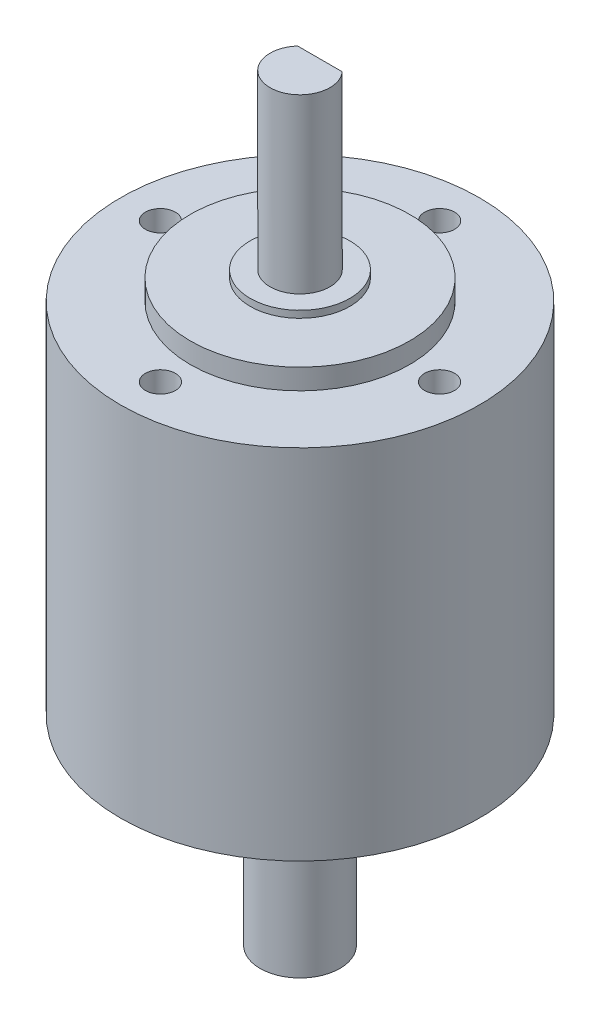
ISO-10303-21;
HEADER;
FILE_DESCRIPTION(('STEP AP214'),'2;1');
FILE_NAME('part.step','',(''),(''),'','','');
FILE_SCHEMA(('AUTOMOTIVE_DESIGN { 1 0 10303 214 1 1 1 1 }'));
ENDSEC;
DATA;
#1=APPLICATION_CONTEXT('core data for automotive mechanical design processes');
#2=APPLICATION_PROTOCOL_DEFINITION('international standard','automotive_design',2000,#1);
#3=PRODUCT_CONTEXT('',#1,'mechanical');
#4=PRODUCT('Part','Part','',(#3));
#5=PRODUCT_RELATED_PRODUCT_CATEGORY('part','',(#4));
#6=PRODUCT_DEFINITION_FORMATION('','',#4);
#7=PRODUCT_DEFINITION_CONTEXT('part definition',#1,'design');
#8=PRODUCT_DEFINITION('design','',#6,#7);
#9=PRODUCT_DEFINITION_SHAPE('','',#8);
#10=(LENGTH_UNIT() NAMED_UNIT(*) SI_UNIT(.MILLI.,.METRE.));
#11=(NAMED_UNIT(*) PLANE_ANGLE_UNIT() SI_UNIT($,.RADIAN.));
#12=(NAMED_UNIT(*) SI_UNIT($,.STERADIAN.) SOLID_ANGLE_UNIT());
#13=UNCERTAINTY_MEASURE_WITH_UNIT(LENGTH_MEASURE(1.E-05),#10,'distance_accuracy_value','');
#14=(GEOMETRIC_REPRESENTATION_CONTEXT(3) GLOBAL_UNCERTAINTY_ASSIGNED_CONTEXT((#13)) GLOBAL_UNIT_ASSIGNED_CONTEXT((#10,
#11,#12)) REPRESENTATION_CONTEXT('',''));
#15=CARTESIAN_POINT('',(0.,0.,0.));
#16=DIRECTION('',(0.,0.,1.));
#17=DIRECTION('',(1.,0.,0.));
#18=AXIS2_PLACEMENT_3D('',#15,#16,#17);
#19=CARTESIAN_POINT('',(0.,17.9451,0.));
#20=DIRECTION('',(0.,-1.,0.));
#21=DIRECTION('',(0.,0.,-1.));
#22=AXIS2_PLACEMENT_3D('',#19,#20,#21);
#23=CYLINDRICAL_SURFACE('',#22,18.);
#24=CARTESIAN_POINT('',(0.,17.9451,0.));
#25=DIRECTION('',(0.,1.,0.));
#26=DIRECTION('',(0.,0.,1.));
#27=AXIS2_PLACEMENT_3D('',#24,#25,#26);
#28=CIRCLE('',#27,18.);
#29=CARTESIAN_POINT('',(0.,17.9451,18.));
#30=VERTEX_POINT('',#29);
#31=EDGE_CURVE('E209',#30,#30,#28,.T.);
#32=ORIENTED_EDGE('',*,*,#31,.F.);
#33=EDGE_LOOP('',(#32));
#34=FACE_BOUND('',#33,.T.);
#35=CARTESIAN_POINT('',(0.,-17.9451,0.));
#36=DIRECTION('',(0.,1.,0.));
#37=DIRECTION('',(0.,0.,1.));
#38=AXIS2_PLACEMENT_3D('',#35,#36,#37);
#39=CIRCLE('',#38,18.);
#40=CARTESIAN_POINT('',(0.,-17.9451,18.));
#41=VERTEX_POINT('',#40);
#42=EDGE_CURVE('E208',#41,#41,#39,.T.);
#43=ORIENTED_EDGE('',*,*,#42,.T.);
#44=EDGE_LOOP('',(#43));
#45=FACE_BOUND('',#44,.T.);
#46=ADVANCED_FACE('F42',(#34,#45),#23,.T.);
#47=CARTESIAN_POINT('',(0.,17.9451,0.));
#48=DIRECTION('',(0.,1.,0.));
#49=DIRECTION('',(0.,0.,1.));
#50=AXIS2_PLACEMENT_3D('',#47,#48,#49);
#51=PLANE('',#50);
#52=CARTESIAN_POINT('',(0.,17.9451,-14.));
#53=DIRECTION('',(0.,1.,0.));
#54=DIRECTION('',(0.,0.,1.));
#55=AXIS2_PLACEMENT_3D('',#52,#53,#54);
#56=CIRCLE('',#55,1.5);
#57=CARTESIAN_POINT('',(0.,17.9451,-12.5));
#58=VERTEX_POINT('',#57);
#59=EDGE_CURVE('E150',#58,#58,#56,.T.);
#60=ORIENTED_EDGE('',*,*,#59,.F.);
#61=EDGE_LOOP('',(#60));
#62=FACE_BOUND('',#61,.T.);
#63=CARTESIAN_POINT('',(-14.,17.9451,0.));
#64=DIRECTION('',(0.,1.,0.));
#65=DIRECTION('',(0.,0.,1.));
#66=AXIS2_PLACEMENT_3D('',#63,#64,#65);
#67=CIRCLE('',#66,1.5);
#68=CARTESIAN_POINT('',(-14.,17.9451,1.5));
#69=VERTEX_POINT('',#68);
#70=EDGE_CURVE('E158',#69,#69,#67,.T.);
#71=ORIENTED_EDGE('',*,*,#70,.F.);
#72=EDGE_LOOP('',(#71));
#73=FACE_BOUND('',#72,.T.);
#74=CARTESIAN_POINT('',(0.,17.9451,14.));
#75=DIRECTION('',(0.,1.,0.));
#76=DIRECTION('',(0.,0.,1.));
#77=AXIS2_PLACEMENT_3D('',#74,#75,#76);
#78=CIRCLE('',#77,1.5);
#79=CARTESIAN_POINT('',(0.,17.9451,15.5));
#80=VERTEX_POINT('',#79);
#81=EDGE_CURVE('E166',#80,#80,#78,.T.);
#82=ORIENTED_EDGE('',*,*,#81,.F.);
#83=EDGE_LOOP('',(#82));
#84=FACE_BOUND('',#83,.T.);
#85=CARTESIAN_POINT('',(14.,17.9451,0.));
#86=DIRECTION('',(0.,1.,0.));
#87=DIRECTION('',(0.,0.,1.));
#88=AXIS2_PLACEMENT_3D('',#85,#86,#87);
#89=CIRCLE('',#88,1.5);
#90=CARTESIAN_POINT('',(14.,17.9451,1.5));
#91=VERTEX_POINT('',#90);
#92=EDGE_CURVE('E117',#91,#91,#89,.T.);
#93=ORIENTED_EDGE('',*,*,#92,.F.);
#94=EDGE_LOOP('',(#93));
#95=FACE_BOUND('',#94,.T.);
#96=CARTESIAN_POINT('',(0.,17.9451,0.));
#97=DIRECTION('',(0.,1.,0.));
#98=DIRECTION('',(0.,0.,1.));
#99=AXIS2_PLACEMENT_3D('',#96,#97,#98);
#100=CIRCLE('',#99,11.);
#101=CARTESIAN_POINT('',(0.,17.9451,11.));
#102=VERTEX_POINT('',#101);
#103=EDGE_CURVE('E201',#102,#102,#100,.F.);
#104=ORIENTED_EDGE('',*,*,#103,.T.);
#105=EDGE_LOOP('',(#104));
#106=FACE_BOUND('',#105,.T.);
#107=ORIENTED_EDGE('',*,*,#31,.T.);
#108=EDGE_LOOP('',(#107));
#109=FACE_BOUND('',#108,.T.);
#110=ADVANCED_FACE('F262',(#62,#73,#84,#95,#106,#109),#51,.T.);
#111=CARTESIAN_POINT('',(0.,-17.9451,0.));
#112=DIRECTION('',(0.,1.,0.));
#113=DIRECTION('',(0.,0.,1.));
#114=AXIS2_PLACEMENT_3D('',#111,#112,#113);
#115=PLANE('',#114);
#116=CARTESIAN_POINT('',(0.,-17.9451,-14.));
#117=DIRECTION('',(0.,1.,0.));
#118=DIRECTION('',(0.,0.,1.));
#119=AXIS2_PLACEMENT_3D('',#116,#117,#118);
#120=CIRCLE('',#119,1.5);
#121=CARTESIAN_POINT('',(0.,-17.9451,-12.5));
#122=VERTEX_POINT('',#121);
#123=EDGE_CURVE('E118',#122,#122,#120,.T.);
#124=ORIENTED_EDGE('',*,*,#123,.T.);
#125=EDGE_LOOP('',(#124));
#126=FACE_BOUND('',#125,.T.);
#127=CARTESIAN_POINT('',(-14.,-17.9451,0.));
#128=DIRECTION('',(0.,1.,0.));
#129=DIRECTION('',(0.,0.,1.));
#130=AXIS2_PLACEMENT_3D('',#127,#128,#129);
#131=CIRCLE('',#130,1.5);
#132=CARTESIAN_POINT('',(-14.,-17.9451,1.5));
#133=VERTEX_POINT('',#132);
#134=EDGE_CURVE('E126',#133,#133,#131,.T.);
#135=ORIENTED_EDGE('',*,*,#134,.T.);
#136=EDGE_LOOP('',(#135));
#137=FACE_BOUND('',#136,.T.);
#138=CARTESIAN_POINT('',(0.,-17.9451,14.));
#139=DIRECTION('',(0.,1.,0.));
#140=DIRECTION('',(0.,0.,1.));
#141=AXIS2_PLACEMENT_3D('',#138,#139,#140);
#142=CIRCLE('',#141,1.5);
#143=CARTESIAN_POINT('',(0.,-17.9451,15.5));
#144=VERTEX_POINT('',#143);
#145=EDGE_CURVE('E134',#144,#144,#142,.T.);
#146=ORIENTED_EDGE('',*,*,#145,.T.);
#147=EDGE_LOOP('',(#146));
#148=FACE_BOUND('',#147,.T.);
#149=CARTESIAN_POINT('',(14.,-17.9451,0.));
#150=DIRECTION('',(0.,1.,0.));
#151=DIRECTION('',(0.,0.,1.));
#152=AXIS2_PLACEMENT_3D('',#149,#150,#151);
#153=CIRCLE('',#152,1.5);
#154=CARTESIAN_POINT('',(14.,-17.9451,1.5));
#155=VERTEX_POINT('',#154);
#156=EDGE_CURVE('E112',#155,#155,#153,.T.);
#157=ORIENTED_EDGE('',*,*,#156,.T.);
#158=EDGE_LOOP('',(#157));
#159=FACE_BOUND('',#158,.T.);
#160=CARTESIAN_POINT('',(0.,-17.9451,0.));
#161=DIRECTION('',(0.,1.,0.));
#162=DIRECTION('',(0.,0.,1.));
#163=AXIS2_PLACEMENT_3D('',#160,#161,#162);
#164=CIRCLE('',#163,11.);
#165=CARTESIAN_POINT('',(0.,-17.9451,11.));
#166=VERTEX_POINT('',#165);
#167=EDGE_CURVE('E213',#166,#166,#164,.F.);
#168=ORIENTED_EDGE('',*,*,#167,.F.);
#169=EDGE_LOOP('',(#168));
#170=FACE_BOUND('',#169,.T.);
#171=ORIENTED_EDGE('',*,*,#42,.F.);
#172=EDGE_LOOP('',(#171));
#173=FACE_BOUND('',#172,.T.);
#174=ADVANCED_FACE('F267',(#126,#137,#148,#159,#170,#173),#115,.F.);
#175=CARTESIAN_POINT('',(0.,-20.0025,0.));
#176=DIRECTION('',(0.,1.,0.));
#177=DIRECTION('',(0.,0.,1.));
#178=AXIS2_PLACEMENT_3D('',#175,#176,#177);
#179=PLANE('',#178);
#180=CARTESIAN_POINT('',(0.,-20.0025,0.));
#181=DIRECTION('',(0.,1.,0.));
#182=DIRECTION('',(0.,0.,1.));
#183=AXIS2_PLACEMENT_3D('',#180,#181,#182);
#184=CIRCLE('',#183,5.);
#185=CARTESIAN_POINT('',(0.,-20.0025,5.));
#186=VERTEX_POINT('',#185);
#187=EDGE_CURVE('E13',#186,#186,#184,.F.);
#188=ORIENTED_EDGE('',*,*,#187,.F.);
#189=EDGE_LOOP('',(#188));
#190=FACE_BOUND('',#189,.T.);
#191=CARTESIAN_POINT('',(0.,-20.0025,0.));
#192=DIRECTION('',(0.,1.,0.));
#193=DIRECTION('',(0.,0.,1.));
#194=AXIS2_PLACEMENT_3D('',#191,#192,#193);
#195=CIRCLE('',#194,11.);
#196=CARTESIAN_POINT('',(0.,-20.0025,11.));
#197=VERTEX_POINT('',#196);
#198=EDGE_CURVE('E196',#197,#197,#195,.T.);
#199=ORIENTED_EDGE('',*,*,#198,.F.);
#200=EDGE_LOOP('',(#199));
#201=FACE_BOUND('',#200,.T.);
#202=ADVANCED_FACE('F275',(#190,#201),#179,.F.);
#203=CARTESIAN_POINT('',(0.,20.0025,0.));
#204=DIRECTION('',(0.,-1.,0.));
#205=DIRECTION('',(0.,0.,-1.));
#206=AXIS2_PLACEMENT_3D('',#203,#204,#205);
#207=CYLINDRICAL_SURFACE('',#206,11.);
#208=ORIENTED_EDGE('',*,*,#198,.T.);
#209=EDGE_LOOP('',(#208));
#210=FACE_BOUND('',#209,.T.);
#211=ORIENTED_EDGE('',*,*,#167,.T.);
#212=EDGE_LOOP('',(#211));
#213=FACE_BOUND('',#212,.T.);
#214=ADVANCED_FACE('F281',(#210,#213),#207,.T.);
#215=ORIENTED_EDGE('',*,*,#103,.F.);
#216=EDGE_LOOP('',(#215));
#217=FACE_BOUND('',#216,.T.);
#218=CARTESIAN_POINT('',(0.,20.0025,0.));
#219=DIRECTION('',(0.,1.,0.));
#220=DIRECTION('',(0.,0.,1.));
#221=AXIS2_PLACEMENT_3D('',#218,#219,#220);
#222=CIRCLE('',#221,11.);
#223=CARTESIAN_POINT('',(0.,20.0025,11.));
#224=VERTEX_POINT('',#223);
#225=EDGE_CURVE('E197',#224,#224,#222,.T.);
#226=ORIENTED_EDGE('',*,*,#225,.F.);
#227=EDGE_LOOP('',(#226));
#228=FACE_BOUND('',#227,.T.);
#229=ADVANCED_FACE('F286',(#217,#228),#207,.T.);
#230=CARTESIAN_POINT('',(0.,20.0025,0.));
#231=DIRECTION('',(0.,1.,0.));
#232=DIRECTION('',(0.,0.,1.));
#233=AXIS2_PLACEMENT_3D('',#230,#231,#232);
#234=PLANE('',#233);
#235=CARTESIAN_POINT('',(0.,20.0025,0.));
#236=DIRECTION('',(0.,1.,0.));
#237=DIRECTION('',(0.,0.,1.));
#238=AXIS2_PLACEMENT_3D('',#235,#236,#237);
#239=CIRCLE('',#238,5.);
#240=CARTESIAN_POINT('',(0.,20.0025,5.));
#241=VERTEX_POINT('',#240);
#242=EDGE_CURVE('E45',#241,#241,#239,.F.);
#243=ORIENTED_EDGE('',*,*,#242,.T.);
#244=EDGE_LOOP('',(#243));
#245=FACE_BOUND('',#244,.T.);
#246=ORIENTED_EDGE('',*,*,#225,.T.);
#247=EDGE_LOOP('',(#246));
#248=FACE_BOUND('',#247,.T.);
#249=ADVANCED_FACE('F288',(#245,#248),#234,.T.);
#250=CARTESIAN_POINT('',(14.,13.9451,0.));
#251=DIRECTION('',(0.,1.,0.));
#252=DIRECTION('',(0.,0.,1.));
#253=AXIS2_PLACEMENT_3D('',#250,#251,#252);
#254=CYLINDRICAL_SURFACE('',#253,1.5);
#255=CARTESIAN_POINT('',(14.,13.9451,0.));
#256=DIRECTION('',(0.,1.,0.));
#257=DIRECTION('',(0.,0.,1.));
#258=AXIS2_PLACEMENT_3D('',#255,#256,#257);
#259=CIRCLE('',#258,1.5);
#260=CARTESIAN_POINT('',(14.,13.9451,1.5));
#261=VERTEX_POINT('',#260);
#262=EDGE_CURVE('E170',#261,#261,#259,.T.);
#263=ORIENTED_EDGE('',*,*,#262,.F.);
#264=EDGE_LOOP('',(#263));
#265=FACE_BOUND('',#264,.T.);
#266=ORIENTED_EDGE('',*,*,#92,.T.);
#267=EDGE_LOOP('',(#266));
#268=FACE_BOUND('',#267,.T.);
#269=ADVANCED_FACE('F293',(#265,#268),#254,.F.);
#270=CARTESIAN_POINT('',(14.,13.9451,0.));
#271=DIRECTION('',(0.,1.,0.));
#272=DIRECTION('',(0.,0.,1.));
#273=AXIS2_PLACEMENT_3D('',#270,#271,#272);
#274=PLANE('',#273);
#275=ORIENTED_EDGE('',*,*,#262,.T.);
#276=EDGE_LOOP('',(#275));
#277=FACE_BOUND('',#276,.T.);
#278=ADVANCED_FACE('F312',(#277),#274,.T.);
#279=CARTESIAN_POINT('',(0.,13.9451,14.));
#280=DIRECTION('',(0.,1.,0.));
#281=DIRECTION('',(0.,0.,1.));
#282=AXIS2_PLACEMENT_3D('',#279,#280,#281);
#283=CYLINDRICAL_SURFACE('',#282,1.5);
#284=CARTESIAN_POINT('',(0.,13.9451,14.));
#285=DIRECTION('',(0.,1.,0.));
#286=DIRECTION('',(0.,0.,1.));
#287=AXIS2_PLACEMENT_3D('',#284,#285,#286);
#288=CIRCLE('',#287,1.5);
#289=CARTESIAN_POINT('',(0.,13.9451,15.5));
#290=VERTEX_POINT('',#289);
#291=EDGE_CURVE('E162',#290,#290,#288,.T.);
#292=ORIENTED_EDGE('',*,*,#291,.F.);
#293=EDGE_LOOP('',(#292));
#294=FACE_BOUND('',#293,.T.);
#295=ORIENTED_EDGE('',*,*,#81,.T.);
#296=EDGE_LOOP('',(#295));
#297=FACE_BOUND('',#296,.T.);
#298=ADVANCED_FACE('F316',(#294,#297),#283,.F.);
#299=CARTESIAN_POINT('',(0.,13.9451,14.));
#300=DIRECTION('',(0.,1.,0.));
#301=DIRECTION('',(0.,0.,1.));
#302=AXIS2_PLACEMENT_3D('',#299,#300,#301);
#303=PLANE('',#302);
#304=ORIENTED_EDGE('',*,*,#291,.T.);
#305=EDGE_LOOP('',(#304));
#306=FACE_BOUND('',#305,.T.);
#307=ADVANCED_FACE('F320',(#306),#303,.T.);
#308=CARTESIAN_POINT('',(-14.,13.9451,0.));
#309=DIRECTION('',(0.,1.,0.));
#310=DIRECTION('',(0.,0.,1.));
#311=AXIS2_PLACEMENT_3D('',#308,#309,#310);
#312=CYLINDRICAL_SURFACE('',#311,1.5);
#313=CARTESIAN_POINT('',(-14.,13.9451,0.));
#314=DIRECTION('',(0.,1.,0.));
#315=DIRECTION('',(0.,0.,1.));
#316=AXIS2_PLACEMENT_3D('',#313,#314,#315);
#317=CIRCLE('',#316,1.5);
#318=CARTESIAN_POINT('',(-14.,13.9451,1.5));
#319=VERTEX_POINT('',#318);
#320=EDGE_CURVE('E154',#319,#319,#317,.T.);
#321=ORIENTED_EDGE('',*,*,#320,.F.);
#322=EDGE_LOOP('',(#321));
#323=FACE_BOUND('',#322,.T.);
#324=ORIENTED_EDGE('',*,*,#70,.T.);
#325=EDGE_LOOP('',(#324));
#326=FACE_BOUND('',#325,.T.);
#327=ADVANCED_FACE('F324',(#323,#326),#312,.F.);
#328=CARTESIAN_POINT('',(-14.,13.9451,0.));
#329=DIRECTION('',(0.,1.,0.));
#330=DIRECTION('',(0.,0.,1.));
#331=AXIS2_PLACEMENT_3D('',#328,#329,#330);
#332=PLANE('',#331);
#333=ORIENTED_EDGE('',*,*,#320,.T.);
#334=EDGE_LOOP('',(#333));
#335=FACE_BOUND('',#334,.T.);
#336=ADVANCED_FACE('F328',(#335),#332,.T.);
#337=CARTESIAN_POINT('',(0.,13.9451,-14.));
#338=DIRECTION('',(0.,1.,0.));
#339=DIRECTION('',(0.,0.,1.));
#340=AXIS2_PLACEMENT_3D('',#337,#338,#339);
#341=CYLINDRICAL_SURFACE('',#340,1.5);
#342=CARTESIAN_POINT('',(0.,13.9451,-14.));
#343=DIRECTION('',(0.,1.,0.));
#344=DIRECTION('',(0.,0.,1.));
#345=AXIS2_PLACEMENT_3D('',#342,#343,#344);
#346=CIRCLE('',#345,1.5);
#347=CARTESIAN_POINT('',(0.,13.9451,-12.5));
#348=VERTEX_POINT('',#347);
#349=EDGE_CURVE('E145',#348,#348,#346,.T.);
#350=ORIENTED_EDGE('',*,*,#349,.F.);
#351=EDGE_LOOP('',(#350));
#352=FACE_BOUND('',#351,.T.);
#353=ORIENTED_EDGE('',*,*,#59,.T.);
#354=EDGE_LOOP('',(#353));
#355=FACE_BOUND('',#354,.T.);
#356=ADVANCED_FACE('F332',(#352,#355),#341,.F.);
#357=CARTESIAN_POINT('',(0.,13.9451,-14.));
#358=DIRECTION('',(0.,1.,0.));
#359=DIRECTION('',(0.,0.,1.));
#360=AXIS2_PLACEMENT_3D('',#357,#358,#359);
#361=PLANE('',#360);
#362=ORIENTED_EDGE('',*,*,#349,.T.);
#363=EDGE_LOOP('',(#362));
#364=FACE_BOUND('',#363,.T.);
#365=ADVANCED_FACE('F336',(#364),#361,.T.);
#366=CARTESIAN_POINT('',(14.,-13.9451,0.));
#367=DIRECTION('',(0.,-1.,0.));
#368=DIRECTION('',(0.,0.,-1.));
#369=AXIS2_PLACEMENT_3D('',#366,#367,#368);
#370=CYLINDRICAL_SURFACE('',#369,1.5);
#371=CARTESIAN_POINT('',(14.,-13.9451,0.));
#372=DIRECTION('',(0.,1.,0.));
#373=DIRECTION('',(0.,0.,1.));
#374=AXIS2_PLACEMENT_3D('',#371,#372,#373);
#375=CIRCLE('',#374,1.5);
#376=CARTESIAN_POINT('',(14.,-13.9451,1.5));
#377=VERTEX_POINT('',#376);
#378=EDGE_CURVE('E138',#377,#377,#375,.T.);
#379=ORIENTED_EDGE('',*,*,#378,.T.);
#380=EDGE_LOOP('',(#379));
#381=FACE_BOUND('',#380,.T.);
#382=ORIENTED_EDGE('',*,*,#156,.F.);
#383=EDGE_LOOP('',(#382));
#384=FACE_BOUND('',#383,.T.);
#385=ADVANCED_FACE('F340',(#381,#384),#370,.F.);
#386=CARTESIAN_POINT('',(14.,-13.9451,0.));
#387=DIRECTION('',(0.,-1.,0.));
#388=DIRECTION('',(0.,0.,1.));
#389=AXIS2_PLACEMENT_3D('',#386,#387,#388);
#390=PLANE('',#389);
#391=ORIENTED_EDGE('',*,*,#378,.F.);
#392=EDGE_LOOP('',(#391));
#393=FACE_BOUND('',#392,.T.);
#394=ADVANCED_FACE('F344',(#393),#390,.T.);
#395=CARTESIAN_POINT('',(0.,-13.9451,14.));
#396=DIRECTION('',(0.,-1.,0.));
#397=DIRECTION('',(0.,0.,-1.));
#398=AXIS2_PLACEMENT_3D('',#395,#396,#397);
#399=CYLINDRICAL_SURFACE('',#398,1.5);
#400=CARTESIAN_POINT('',(0.,-13.9451,14.));
#401=DIRECTION('',(0.,1.,0.));
#402=DIRECTION('',(0.,0.,1.));
#403=AXIS2_PLACEMENT_3D('',#400,#401,#402);
#404=CIRCLE('',#403,1.5);
#405=CARTESIAN_POINT('',(0.,-13.9451,15.5));
#406=VERTEX_POINT('',#405);
#407=EDGE_CURVE('E130',#406,#406,#404,.T.);
#408=ORIENTED_EDGE('',*,*,#407,.T.);
#409=EDGE_LOOP('',(#408));
#410=FACE_BOUND('',#409,.T.);
#411=ORIENTED_EDGE('',*,*,#145,.F.);
#412=EDGE_LOOP('',(#411));
#413=FACE_BOUND('',#412,.T.);
#414=ADVANCED_FACE('F348',(#410,#413),#399,.F.);
#415=CARTESIAN_POINT('',(0.,-13.9451,14.));
#416=DIRECTION('',(0.,-1.,0.));
#417=DIRECTION('',(0.,0.,1.));
#418=AXIS2_PLACEMENT_3D('',#415,#416,#417);
#419=PLANE('',#418);
#420=ORIENTED_EDGE('',*,*,#407,.F.);
#421=EDGE_LOOP('',(#420));
#422=FACE_BOUND('',#421,.T.);
#423=ADVANCED_FACE('F352',(#422),#419,.T.);
#424=CARTESIAN_POINT('',(-14.,-13.9451,0.));
#425=DIRECTION('',(0.,-1.,0.));
#426=DIRECTION('',(0.,0.,-1.));
#427=AXIS2_PLACEMENT_3D('',#424,#425,#426);
#428=CYLINDRICAL_SURFACE('',#427,1.5);
#429=CARTESIAN_POINT('',(-14.,-13.9451,0.));
#430=DIRECTION('',(0.,1.,0.));
#431=DIRECTION('',(0.,0.,1.));
#432=AXIS2_PLACEMENT_3D('',#429,#430,#431);
#433=CIRCLE('',#432,1.5);
#434=CARTESIAN_POINT('',(-14.,-13.9451,1.5));
#435=VERTEX_POINT('',#434);
#436=EDGE_CURVE('E122',#435,#435,#433,.T.);
#437=ORIENTED_EDGE('',*,*,#436,.T.);
#438=EDGE_LOOP('',(#437));
#439=FACE_BOUND('',#438,.T.);
#440=ORIENTED_EDGE('',*,*,#134,.F.);
#441=EDGE_LOOP('',(#440));
#442=FACE_BOUND('',#441,.T.);
#443=ADVANCED_FACE('F356',(#439,#442),#428,.F.);
#444=CARTESIAN_POINT('',(-14.,-13.9451,0.));
#445=DIRECTION('',(0.,-1.,0.));
#446=DIRECTION('',(0.,0.,1.));
#447=AXIS2_PLACEMENT_3D('',#444,#445,#446);
#448=PLANE('',#447);
#449=ORIENTED_EDGE('',*,*,#436,.F.);
#450=EDGE_LOOP('',(#449));
#451=FACE_BOUND('',#450,.T.);
#452=ADVANCED_FACE('F360',(#451),#448,.T.);
#453=CARTESIAN_POINT('',(0.,-13.9451,-14.));
#454=DIRECTION('',(0.,-1.,0.));
#455=DIRECTION('',(0.,0.,-1.));
#456=AXIS2_PLACEMENT_3D('',#453,#454,#455);
#457=CYLINDRICAL_SURFACE('',#456,1.5);
#458=CARTESIAN_POINT('',(0.,-13.9451,-14.));
#459=DIRECTION('',(0.,1.,0.));
#460=DIRECTION('',(0.,0.,1.));
#461=AXIS2_PLACEMENT_3D('',#458,#459,#460);
#462=CIRCLE('',#461,1.5);
#463=CARTESIAN_POINT('',(0.,-13.9451,-12.5));
#464=VERTEX_POINT('',#463);
#465=EDGE_CURVE('E113',#464,#464,#462,.T.);
#466=ORIENTED_EDGE('',*,*,#465,.T.);
#467=EDGE_LOOP('',(#466));
#468=FACE_BOUND('',#467,.T.);
#469=ORIENTED_EDGE('',*,*,#123,.F.);
#470=EDGE_LOOP('',(#469));
#471=FACE_BOUND('',#470,.T.);
#472=ADVANCED_FACE('F257',(#468,#471),#457,.F.);
#473=CARTESIAN_POINT('',(0.,-13.9451,-14.));
#474=DIRECTION('',(0.,-1.,0.));
#475=DIRECTION('',(0.,0.,1.));
#476=AXIS2_PLACEMENT_3D('',#473,#474,#475);
#477=PLANE('',#476);
#478=ORIENTED_EDGE('',*,*,#465,.F.);
#479=EDGE_LOOP('',(#478));
#480=FACE_BOUND('',#479,.T.);
#481=ADVANCED_FACE('F247',(#480),#477,.T.);
#482=CARTESIAN_POINT('',(0.,-20.701,0.));
#483=DIRECTION('',(0.,1.,0.));
#484=DIRECTION('',(0.,0.,1.));
#485=AXIS2_PLACEMENT_3D('',#482,#483,#484);
#486=PLANE('',#485);
#487=CARTESIAN_POINT('',(0.,-20.701,0.));
#488=DIRECTION('',(0.,1.,0.));
#489=DIRECTION('',(0.,0.,1.));
#490=AXIS2_PLACEMENT_3D('',#487,#488,#489);
#491=CIRCLE('',#490,4.);
#492=CARTESIAN_POINT('',(0.,-20.701,4.));
#493=VERTEX_POINT('',#492);
#494=EDGE_CURVE('E51',#493,#493,#491,.T.);
#495=ORIENTED_EDGE('',*,*,#494,.T.);
#496=EDGE_LOOP('',(#495));
#497=FACE_BOUND('',#496,.T.);
#498=CARTESIAN_POINT('',(0.,-20.701,0.));
#499=DIRECTION('',(0.,1.,0.));
#500=DIRECTION('',(0.,0.,1.));
#501=AXIS2_PLACEMENT_3D('',#498,#499,#500);
#502=CIRCLE('',#501,5.);
#503=CARTESIAN_POINT('',(0.,-20.701,5.));
#504=VERTEX_POINT('',#503);
#505=EDGE_CURVE('E232',#504,#504,#502,.T.);
#506=ORIENTED_EDGE('',*,*,#505,.F.);
#507=EDGE_LOOP('',(#506));
#508=FACE_BOUND('',#507,.T.);
#509=ADVANCED_FACE('F245',(#497,#508),#486,.F.);
#510=CARTESIAN_POINT('',(0.,20.701,0.));
#511=DIRECTION('',(0.,-1.,0.));
#512=DIRECTION('',(0.,0.,-1.));
#513=AXIS2_PLACEMENT_3D('',#510,#511,#512);
#514=CYLINDRICAL_SURFACE('',#513,5.);
#515=ORIENTED_EDGE('',*,*,#505,.T.);
#516=EDGE_LOOP('',(#515));
#517=FACE_BOUND('',#516,.T.);
#518=ORIENTED_EDGE('',*,*,#187,.T.);
#519=EDGE_LOOP('',(#518));
#520=FACE_BOUND('',#519,.T.);
#521=ADVANCED_FACE('F242',(#517,#520),#514,.T.);
#522=CARTESIAN_POINT('',(0.,-23.0025,0.));
#523=DIRECTION('',(0.,1.,0.));
#524=DIRECTION('',(0.,0.,1.));
#525=AXIS2_PLACEMENT_3D('',#522,#523,#524);
#526=PLANE('',#525);
#527=CARTESIAN_POINT('',(0.,-23.0025,0.));
#528=DIRECTION('',(0.,1.,0.));
#529=DIRECTION('',(0.,0.,1.));
#530=AXIS2_PLACEMENT_3D('',#527,#528,#529);
#531=CIRCLE('',#530,4.);
#532=CARTESIAN_POINT('',(-2.64575131106459,-23.0025,-3.));
#533=VERTEX_POINT('',#532);
#534=CARTESIAN_POINT('',(2.64575131106459,-23.0025,-3.));
#535=VERTEX_POINT('',#534);
#536=EDGE_CURVE('E95',#533,#535,#531,.F.);
#537=ORIENTED_EDGE('',*,*,#536,.T.);
#538=DIRECTION('',(-1.,0.,0.));
#539=VECTOR('',#538,1.);
#540=CARTESIAN_POINT('',(-2.64575131106459,-23.0025,-3.));
#541=LINE('',#540,#539);
#542=EDGE_CURVE('E87',#535,#533,#541,.T.);
#543=ORIENTED_EDGE('',*,*,#542,.T.);
#544=EDGE_LOOP('',(#537,#543));
#545=FACE_BOUND('',#544,.T.);
#546=ADVANCED_FACE('F98',(#545),#526,.F.);
#547=CARTESIAN_POINT('',(-2.64575131106459,-14.6173351928655,-3.));
#548=DIRECTION('',(0.,0.,1.));
#549=DIRECTION('',(1.,0.,0.));
#550=AXIS2_PLACEMENT_3D('',#547,#548,#549);
#551=PLANE('',#550);
#552=DIRECTION('',(0.,-1.,0.));
#553=VECTOR('',#552,1.);
#554=CARTESIAN_POINT('',(2.64575131106459,-14.6173351928655,-3.));
#555=LINE('',#554,#553);
#556=CARTESIAN_POINT('',(2.64575131106459,-38.0025,-3.));
#557=VERTEX_POINT('',#556);
#558=EDGE_CURVE('E59',#535,#557,#555,.T.);
#559=ORIENTED_EDGE('',*,*,#558,.T.);
#560=DIRECTION('',(-1.,0.,0.));
#561=VECTOR('',#560,1.);
#562=CARTESIAN_POINT('',(-2.64575131106459,-38.0025,-3.));
#563=LINE('',#562,#561);
#564=CARTESIAN_POINT('',(-2.64575131106459,-38.0025,-3.));
#565=VERTEX_POINT('',#564);
#566=EDGE_CURVE('E89',#557,#565,#563,.T.);
#567=ORIENTED_EDGE('',*,*,#566,.T.);
#568=DIRECTION('',(0.,-1.,0.));
#569=VECTOR('',#568,1.);
#570=CARTESIAN_POINT('',(-2.64575131106459,-14.6173351928655,-3.));
#571=LINE('',#570,#569);
#572=EDGE_CURVE('E84',#533,#565,#571,.T.);
#573=ORIENTED_EDGE('',*,*,#572,.F.);
#574=ORIENTED_EDGE('',*,*,#542,.F.);
#575=EDGE_LOOP('',(#559,#567,#573,#574));
#576=FACE_BOUND('',#575,.T.);
#577=ADVANCED_FACE('F86',(#576),#551,.F.);
#578=CARTESIAN_POINT('',(0.,-38.0025,0.));
#579=DIRECTION('',(0.,-1.,0.));
#580=DIRECTION('',(0.,0.,-1.));
#581=AXIS2_PLACEMENT_3D('',#578,#579,#580);
#582=PLANE('',#581);
#583=ORIENTED_EDGE('',*,*,#566,.F.);
#584=CARTESIAN_POINT('',(0.,-38.0025,0.));
#585=DIRECTION('',(0.,-1.,0.));
#586=DIRECTION('',(0.,0.,-1.));
#587=AXIS2_PLACEMENT_3D('',#584,#585,#586);
#588=CIRCLE('',#587,4.);
#589=EDGE_CURVE('E106',#557,#565,#588,.T.);
#590=ORIENTED_EDGE('',*,*,#589,.T.);
#591=EDGE_LOOP('',(#583,#590));
#592=FACE_BOUND('',#591,.T.);
#593=ADVANCED_FACE('F370',(#592),#582,.T.);
#594=CARTESIAN_POINT('',(0.,-38.0025,0.));
#595=DIRECTION('',(0.,1.,0.));
#596=DIRECTION('',(0.,0.,1.));
#597=AXIS2_PLACEMENT_3D('',#594,#595,#596);
#598=CYLINDRICAL_SURFACE('',#597,4.);
#599=ORIENTED_EDGE('',*,*,#589,.F.);
#600=ORIENTED_EDGE('',*,*,#558,.F.);
#601=ORIENTED_EDGE('',*,*,#536,.F.);
#602=ORIENTED_EDGE('',*,*,#572,.T.);
#603=EDGE_LOOP('',(#599,#600,#601,#602));
#604=FACE_BOUND('',#603,.T.);
#605=ORIENTED_EDGE('',*,*,#494,.F.);
#606=EDGE_LOOP('',(#605));
#607=FACE_BOUND('',#606,.T.);
#608=ADVANCED_FACE('F101',(#604,#607),#598,.T.);
#609=ORIENTED_EDGE('',*,*,#242,.F.);
#610=EDGE_LOOP('',(#609));
#611=FACE_BOUND('',#610,.T.);
#612=CARTESIAN_POINT('',(0.,20.701,0.));
#613=DIRECTION('',(0.,1.,0.));
#614=DIRECTION('',(0.,0.,1.));
#615=AXIS2_PLACEMENT_3D('',#612,#613,#614);
#616=CIRCLE('',#615,5.);
#617=CARTESIAN_POINT('',(0.,20.701,5.));
#618=VERTEX_POINT('',#617);
#619=EDGE_CURVE('E225',#618,#618,#616,.T.);
#620=ORIENTED_EDGE('',*,*,#619,.F.);
#621=EDGE_LOOP('',(#620));
#622=FACE_BOUND('',#621,.T.);
#623=ADVANCED_FACE('F255',(#611,#622),#514,.T.);
#624=CARTESIAN_POINT('',(0.,20.701,0.));
#625=DIRECTION('',(0.,1.,0.));
#626=DIRECTION('',(0.,0.,1.));
#627=AXIS2_PLACEMENT_3D('',#624,#625,#626);
#628=PLANE('',#627);
#629=CARTESIAN_POINT('',(0.,20.701,0.));
#630=DIRECTION('',(0.,1.,0.));
#631=DIRECTION('',(0.,0.,1.));
#632=AXIS2_PLACEMENT_3D('',#629,#630,#631);
#633=CIRCLE('',#632,3.);
#634=CARTESIAN_POINT('',(0.,20.701,3.));
#635=VERTEX_POINT('',#634);
#636=EDGE_CURVE('E222',#635,#635,#633,.T.);
#637=ORIENTED_EDGE('',*,*,#636,.F.);
#638=EDGE_LOOP('',(#637));
#639=FACE_BOUND('',#638,.T.);
#640=ORIENTED_EDGE('',*,*,#619,.T.);
#641=EDGE_LOOP('',(#640));
#642=FACE_BOUND('',#641,.T.);
#643=ADVANCED_FACE('F308',(#639,#642),#628,.T.);
#644=CARTESIAN_POINT('',(0.,23.0025,0.));
#645=DIRECTION('',(0.,1.,0.));
#646=DIRECTION('',(0.,0.,1.));
#647=AXIS2_PLACEMENT_3D('',#644,#645,#646);
#648=PLANE('',#647);
#649=CARTESIAN_POINT('',(0.,23.0025,0.));
#650=DIRECTION('',(0.,1.,0.));
#651=DIRECTION('',(0.,0.,1.));
#652=AXIS2_PLACEMENT_3D('',#649,#650,#651);
#653=CIRCLE('',#652,3.);
#654=CARTESIAN_POINT('',(2.23606797749979,23.0025,-2.));
#655=VERTEX_POINT('',#654);
#656=CARTESIAN_POINT('',(-2.23606797749979,23.0025,-2.));
#657=VERTEX_POINT('',#656);
#658=EDGE_CURVE('E177',#655,#657,#653,.T.);
#659=ORIENTED_EDGE('',*,*,#658,.T.);
#660=DIRECTION('',(1.,0.,0.));
#661=VECTOR('',#660,1.);
#662=CARTESIAN_POINT('',(-2.23606797749979,23.0025,-2.));
#663=LINE('',#662,#661);
#664=EDGE_CURVE('E180',#657,#655,#663,.T.);
#665=ORIENTED_EDGE('',*,*,#664,.T.);
#666=EDGE_LOOP('',(#659,#665));
#667=FACE_BOUND('',#666,.T.);
#668=ADVANCED_FACE('F305',(#667),#648,.T.);
#669=CARTESIAN_POINT('',(-2.23606797749979,23.0025,-2.));
#670=DIRECTION('',(0.,0.,1.));
#671=DIRECTION('',(1.,0.,0.));
#672=AXIS2_PLACEMENT_3D('',#669,#670,#671);
#673=PLANE('',#672);
#674=DIRECTION('',(1.,0.,0.));
#675=VECTOR('',#674,1.);
#676=CARTESIAN_POINT('',(-2.23606797749979,38.0025,-2.));
#677=LINE('',#676,#675);
#678=CARTESIAN_POINT('',(-2.23606797749979,38.0025,-2.));
#679=VERTEX_POINT('',#678);
#680=CARTESIAN_POINT('',(2.23606797749979,38.0025,-2.));
#681=VERTEX_POINT('',#680);
#682=EDGE_CURVE('E149',#679,#681,#677,.T.);
#683=ORIENTED_EDGE('',*,*,#682,.T.);
#684=DIRECTION('',(0.,1.,0.));
#685=VECTOR('',#684,1.);
#686=CARTESIAN_POINT('',(2.23606797749979,23.0025,-2.));
#687=LINE('',#686,#685);
#688=EDGE_CURVE('E186',#655,#681,#687,.T.);
#689=ORIENTED_EDGE('',*,*,#688,.F.);
#690=ORIENTED_EDGE('',*,*,#664,.F.);
#691=DIRECTION('',(0.,1.,0.));
#692=VECTOR('',#691,1.);
#693=CARTESIAN_POINT('',(-2.23606797749979,23.0025,-2.));
#694=LINE('',#693,#692);
#695=EDGE_CURVE('E67',#657,#679,#694,.T.);
#696=ORIENTED_EDGE('',*,*,#695,.T.);
#697=EDGE_LOOP('',(#683,#689,#690,#696));
#698=FACE_BOUND('',#697,.T.);
#699=ADVANCED_FACE('F301',(#698),#673,.F.);
#700=CARTESIAN_POINT('',(0.,38.0025,0.));
#701=DIRECTION('',(0.,1.,0.));
#702=DIRECTION('',(0.,0.,1.));
#703=AXIS2_PLACEMENT_3D('',#700,#701,#702);
#704=PLANE('',#703);
#705=ORIENTED_EDGE('',*,*,#682,.F.);
#706=CARTESIAN_POINT('',(0.,38.0025,0.));
#707=DIRECTION('',(0.,1.,0.));
#708=DIRECTION('',(0.,0.,1.));
#709=AXIS2_PLACEMENT_3D('',#706,#707,#708);
#710=CIRCLE('',#709,3.);
#711=EDGE_CURVE('E190',#679,#681,#710,.T.);
#712=ORIENTED_EDGE('',*,*,#711,.T.);
#713=EDGE_LOOP('',(#705,#712));
#714=FACE_BOUND('',#713,.T.);
#715=ADVANCED_FACE('F298',(#714),#704,.T.);
#716=CARTESIAN_POINT('',(0.,38.0025,0.));
#717=DIRECTION('',(0.,-1.,0.));
#718=DIRECTION('',(0.,0.,-1.));
#719=AXIS2_PLACEMENT_3D('',#716,#717,#718);
#720=CYLINDRICAL_SURFACE('',#719,3.);
#721=ORIENTED_EDGE('',*,*,#636,.T.);
#722=EDGE_LOOP('',(#721));
#723=FACE_BOUND('',#722,.T.);
#724=ORIENTED_EDGE('',*,*,#711,.F.);
#725=ORIENTED_EDGE('',*,*,#695,.F.);
#726=ORIENTED_EDGE('',*,*,#658,.F.);
#727=ORIENTED_EDGE('',*,*,#688,.T.);
#728=EDGE_LOOP('',(#724,#725,#726,#727));
#729=FACE_BOUND('',#728,.T.);
#730=ADVANCED_FACE('F295',(#723,#729),#720,.T.);
#731=CLOSED_SHELL('',(#46,#110,#174,#202,#214,#229,#249,#269,#278,#298,#307,#327,#336,#356,#365,
#385,#394,#414,#423,#443,#452,#472,#481,#509,#521,#546,#577,#593,#608,#623,#643,#668,#699,#715,#730));
#732=MANIFOLD_SOLID_BREP('B2',#731);
#733=ADVANCED_BREP_SHAPE_REPRESENTATION('',(#18,#732),#14);
#734=SHAPE_DEFINITION_REPRESENTATION(#9,#733);
ENDSEC;
END-ISO-10303-21;
